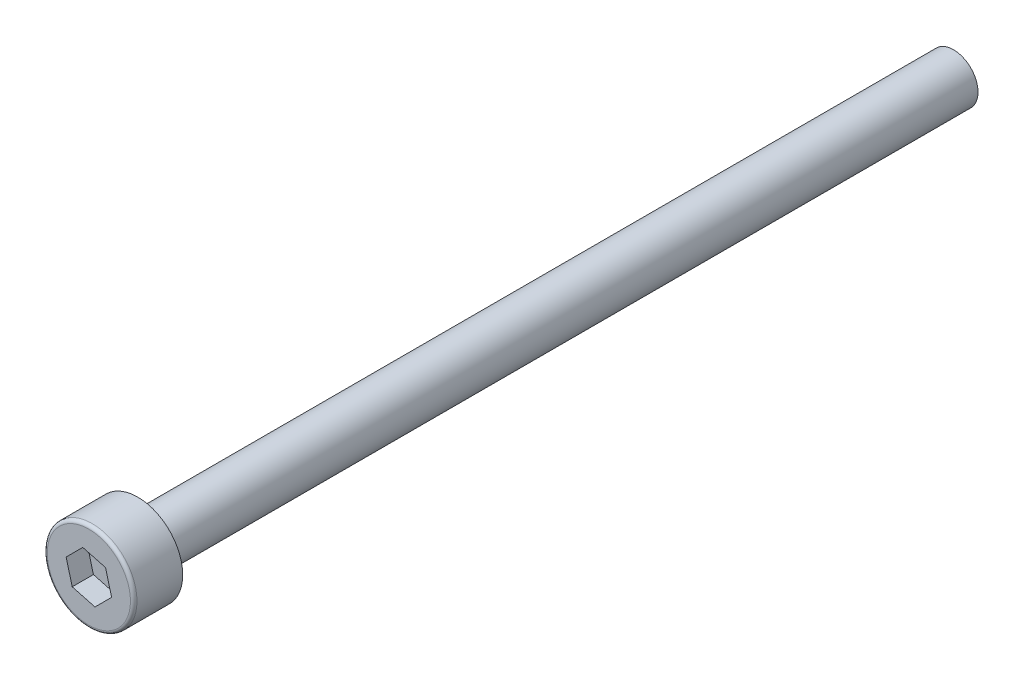
ISO-10303-21;
HEADER;
FILE_DESCRIPTION(('STEP AP214'),'2;1');
FILE_NAME('part.step','',(''),(''),'','','');
FILE_SCHEMA(('AUTOMOTIVE_DESIGN { 1 0 10303 214 1 1 1 1 }'));
ENDSEC;
DATA;
#1=APPLICATION_CONTEXT('core data for automotive mechanical design processes');
#2=APPLICATION_PROTOCOL_DEFINITION('international standard','automotive_design',2000,#1);
#3=PRODUCT_CONTEXT('',#1,'mechanical');
#4=PRODUCT('Part','Part','',(#3));
#5=PRODUCT_RELATED_PRODUCT_CATEGORY('part','',(#4));
#6=PRODUCT_DEFINITION_FORMATION('','',#4);
#7=PRODUCT_DEFINITION_CONTEXT('part definition',#1,'design');
#8=PRODUCT_DEFINITION('design','',#6,#7);
#9=PRODUCT_DEFINITION_SHAPE('','',#8);
#10=(LENGTH_UNIT() NAMED_UNIT(*) SI_UNIT(.MILLI.,.METRE.));
#11=(NAMED_UNIT(*) PLANE_ANGLE_UNIT() SI_UNIT($,.RADIAN.));
#12=(NAMED_UNIT(*) SI_UNIT($,.STERADIAN.) SOLID_ANGLE_UNIT());
#13=UNCERTAINTY_MEASURE_WITH_UNIT(LENGTH_MEASURE(1.E-05),#10,'distance_accuracy_value','');
#14=(GEOMETRIC_REPRESENTATION_CONTEXT(3) GLOBAL_UNCERTAINTY_ASSIGNED_CONTEXT((#13)) GLOBAL_UNIT_ASSIGNED_CONTEXT((#10,
#11,#12)) REPRESENTATION_CONTEXT('',''));
#15=CARTESIAN_POINT('',(0.,0.,0.));
#16=DIRECTION('',(0.,0.,1.));
#17=DIRECTION('',(1.,0.,0.));
#18=AXIS2_PLACEMENT_3D('',#15,#16,#17);
#19=CARTESIAN_POINT('',(0.,0.,0.));
#20=DIRECTION('',(0.,0.,1.));
#21=DIRECTION('',(1.,0.,0.));
#22=AXIS2_PLACEMENT_3D('',#19,#20,#21);
#23=PLANE('',#22);
#24=CARTESIAN_POINT('',(0.,0.,0.));
#25=DIRECTION('',(0.,0.,1.));
#26=DIRECTION('',(1.,0.,0.));
#27=AXIS2_PLACEMENT_3D('',#24,#25,#26);
#28=CIRCLE('',#27,2.75);
#29=CARTESIAN_POINT('',(2.75,0.,0.));
#30=VERTEX_POINT('',#29);
#31=EDGE_CURVE('E137',#30,#30,#28,.T.);
#32=ORIENTED_EDGE('',*,*,#31,.F.);
#33=EDGE_LOOP('',(#32));
#34=FACE_BOUND('',#33,.T.);
#35=CARTESIAN_POINT('',(0.,0.,0.));
#36=DIRECTION('',(0.,0.,1.));
#37=DIRECTION('',(1.,0.,0.));
#38=AXIS2_PLACEMENT_3D('',#35,#36,#37);
#39=CIRCLE('',#38,1.5);
#40=CARTESIAN_POINT('',(1.5,0.,0.));
#41=VERTEX_POINT('',#40);
#42=EDGE_CURVE('E145',#41,#41,#39,.F.);
#43=ORIENTED_EDGE('',*,*,#42,.F.);
#44=EDGE_LOOP('',(#43));
#45=FACE_BOUND('',#44,.T.);
#46=ADVANCED_FACE('F34',(#34,#45),#23,.F.);
#47=CARTESIAN_POINT('',(0.,0.,3.));
#48=DIRECTION('',(0.,0.,-1.));
#49=DIRECTION('',(-1.,0.,0.));
#50=AXIS2_PLACEMENT_3D('',#47,#48,#49);
#51=CYLINDRICAL_SURFACE('',#50,2.75);
#52=CARTESIAN_POINT('',(0.,0.,2.8));
#53=DIRECTION('',(0.,0.,1.));
#54=DIRECTION('',(1.,0.,0.));
#55=AXIS2_PLACEMENT_3D('',#52,#53,#54);
#56=CIRCLE('',#55,2.75);
#57=CARTESIAN_POINT('',(2.75,0.,2.8));
#58=VERTEX_POINT('',#57);
#59=EDGE_CURVE('E11',#58,#58,#56,.F.);
#60=ORIENTED_EDGE('',*,*,#59,.T.);
#61=EDGE_LOOP('',(#60));
#62=FACE_BOUND('',#61,.T.);
#63=ORIENTED_EDGE('',*,*,#31,.T.);
#64=EDGE_LOOP('',(#63));
#65=FACE_BOUND('',#64,.T.);
#66=ADVANCED_FACE('F164',(#62,#65),#51,.T.);
#67=CARTESIAN_POINT('',(0.,0.,3.));
#68=DIRECTION('',(0.,0.,1.));
#69=DIRECTION('',(1.,0.,0.));
#70=AXIS2_PLACEMENT_3D('',#67,#68,#69);
#71=PLANE('',#70);
#72=CARTESIAN_POINT('',(0.,0.,3.));
#73=DIRECTION('',(0.,0.,1.));
#74=DIRECTION('',(1.,0.,0.));
#75=AXIS2_PLACEMENT_3D('',#72,#73,#74);
#76=CIRCLE('',#75,2.55);
#77=CARTESIAN_POINT('',(2.55,0.,3.));
#78=VERTEX_POINT('',#77);
#79=EDGE_CURVE('E42',#78,#78,#76,.T.);
#80=ORIENTED_EDGE('',*,*,#79,.T.);
#81=EDGE_LOOP('',(#80));
#82=FACE_BOUND('',#81,.T.);
#83=DIRECTION('',(0.258819045102521,-0.965925826289068,0.));
#84=VECTOR('',#83,1.);
#85=CARTESIAN_POINT('',(-1.39419383956301,0.373573113403356,3.));
#86=LINE('',#85,#84);
#87=CARTESIAN_POINT('',(-1.39419383956301,0.373573113403356,3.));
#88=VERTEX_POINT('',#87);
#89=CARTESIAN_POINT('',(-1.02062072615966,-1.02062072615966,3.));
#90=VERTEX_POINT('',#89);
#91=EDGE_CURVE('E49',#88,#90,#86,.T.);
#92=ORIENTED_EDGE('',*,*,#91,.F.);
#93=DIRECTION('',(-0.707106781186548,-0.707106781186548,0.));
#94=VECTOR('',#93,1.);
#95=CARTESIAN_POINT('',(-0.373573113403355,1.39419383956301,3.));
#96=LINE('',#95,#94);
#97=CARTESIAN_POINT('',(-0.373573113403355,1.39419383956301,3.));
#98=VERTEX_POINT('',#97);
#99=EDGE_CURVE('E133',#98,#88,#96,.T.);
#100=ORIENTED_EDGE('',*,*,#99,.F.);
#101=DIRECTION('',(-0.965925826289068,0.258819045102521,0.));
#102=VECTOR('',#101,1.);
#103=CARTESIAN_POINT('',(1.02062072615966,1.02062072615966,3.));
#104=LINE('',#103,#102);
#105=CARTESIAN_POINT('',(1.02062072615966,1.02062072615966,3.));
#106=VERTEX_POINT('',#105);
#107=EDGE_CURVE('E131',#106,#98,#104,.T.);
#108=ORIENTED_EDGE('',*,*,#107,.F.);
#109=DIRECTION('',(-0.258819045102521,0.965925826289068,0.));
#110=VECTOR('',#109,1.);
#111=CARTESIAN_POINT('',(1.39419383956301,-0.373573113403355,3.));
#112=LINE('',#111,#110);
#113=CARTESIAN_POINT('',(1.39419383956301,-0.373573113403355,3.));
#114=VERTEX_POINT('',#113);
#115=EDGE_CURVE('E97',#114,#106,#112,.T.);
#116=ORIENTED_EDGE('',*,*,#115,.F.);
#117=DIRECTION('',(0.707106781186548,0.707106781186548,0.));
#118=VECTOR('',#117,1.);
#119=CARTESIAN_POINT('',(0.373573113403355,-1.39419383956301,3.));
#120=LINE('',#119,#118);
#121=CARTESIAN_POINT('',(0.373573113403355,-1.39419383956301,3.));
#122=VERTEX_POINT('',#121);
#123=EDGE_CURVE('E127',#122,#114,#120,.T.);
#124=ORIENTED_EDGE('',*,*,#123,.F.);
#125=DIRECTION('',(0.965925826289068,-0.258819045102521,0.));
#126=VECTOR('',#125,1.);
#127=CARTESIAN_POINT('',(-1.02062072615966,-1.02062072615966,3.));
#128=LINE('',#127,#126);
#129=EDGE_CURVE('E123',#90,#122,#128,.T.);
#130=ORIENTED_EDGE('',*,*,#129,.F.);
#131=EDGE_LOOP('',(#92,#100,#108,#116,#124,#130));
#132=FACE_BOUND('',#131,.T.);
#133=ADVANCED_FACE('F150',(#82,#132),#71,.T.);
#134=CARTESIAN_POINT('',(-1.39419383956301,0.373573113403356,1.7));
#135=DIRECTION('',(-0.965925826289068,-0.258819045102521,0.));
#136=DIRECTION('',(0.258819045102521,-0.965925826289068,0.));
#137=AXIS2_PLACEMENT_3D('',#134,#135,#136);
#138=PLANE('',#137);
#139=ORIENTED_EDGE('',*,*,#91,.T.);
#140=DIRECTION('',(0.,0.,1.));
#141=VECTOR('',#140,1.);
#142=CARTESIAN_POINT('',(-1.02062072615966,-1.02062072615966,1.7));
#143=LINE('',#142,#141);
#144=CARTESIAN_POINT('',(-1.02062072615966,-1.02062072615966,1.7));
#145=VERTEX_POINT('',#144);
#146=EDGE_CURVE('E79',#145,#90,#143,.T.);
#147=ORIENTED_EDGE('',*,*,#146,.F.);
#148=DIRECTION('',(0.258819045102521,-0.965925826289068,0.));
#149=VECTOR('',#148,1.);
#150=CARTESIAN_POINT('',(-1.39419383956301,0.373573113403356,1.7));
#151=LINE('',#150,#149);
#152=CARTESIAN_POINT('',(-1.39419383956301,0.373573113403356,1.7));
#153=VERTEX_POINT('',#152);
#154=EDGE_CURVE('E135',#153,#145,#151,.T.);
#155=ORIENTED_EDGE('',*,*,#154,.F.);
#156=DIRECTION('',(0.,0.,1.));
#157=VECTOR('',#156,1.);
#158=CARTESIAN_POINT('',(-1.39419383956301,0.373573113403356,1.7));
#159=LINE('',#158,#157);
#160=EDGE_CURVE('E57',#153,#88,#159,.T.);
#161=ORIENTED_EDGE('',*,*,#160,.T.);
#162=EDGE_LOOP('',(#139,#147,#155,#161));
#163=FACE_BOUND('',#162,.T.);
#164=ADVANCED_FACE('F176',(#163),#138,.F.);
#165=CARTESIAN_POINT('',(-0.373573113403355,1.39419383956301,1.7));
#166=DIRECTION('',(-0.707106781186548,0.707106781186548,0.));
#167=DIRECTION('',(-0.707106781186548,-0.707106781186548,0.));
#168=AXIS2_PLACEMENT_3D('',#165,#166,#167);
#169=PLANE('',#168);
#170=ORIENTED_EDGE('',*,*,#99,.T.);
#171=ORIENTED_EDGE('',*,*,#160,.F.);
#172=DIRECTION('',(-0.707106781186548,-0.707106781186548,0.));
#173=VECTOR('',#172,1.);
#174=CARTESIAN_POINT('',(-0.373573113403355,1.39419383956301,1.7));
#175=LINE('',#174,#173);
#176=CARTESIAN_POINT('',(-0.373573113403355,1.39419383956301,1.7));
#177=VERTEX_POINT('',#176);
#178=EDGE_CURVE('E109',#177,#153,#175,.T.);
#179=ORIENTED_EDGE('',*,*,#178,.F.);
#180=DIRECTION('',(0.,0.,1.));
#181=VECTOR('',#180,1.);
#182=CARTESIAN_POINT('',(-0.373573113403355,1.39419383956301,1.7));
#183=LINE('',#182,#181);
#184=EDGE_CURVE('E101',#177,#98,#183,.T.);
#185=ORIENTED_EDGE('',*,*,#184,.T.);
#186=EDGE_LOOP('',(#170,#171,#179,#185));
#187=FACE_BOUND('',#186,.T.);
#188=ADVANCED_FACE('F179',(#187),#169,.F.);
#189=CARTESIAN_POINT('',(1.02062072615966,1.02062072615966,1.7));
#190=DIRECTION('',(0.258819045102521,0.965925826289068,0.));
#191=DIRECTION('',(-0.965925826289068,0.258819045102521,0.));
#192=AXIS2_PLACEMENT_3D('',#189,#190,#191);
#193=PLANE('',#192);
#194=ORIENTED_EDGE('',*,*,#107,.T.);
#195=ORIENTED_EDGE('',*,*,#184,.F.);
#196=DIRECTION('',(-0.965925826289068,0.258819045102521,0.));
#197=VECTOR('',#196,1.);
#198=CARTESIAN_POINT('',(1.02062072615966,1.02062072615966,1.7));
#199=LINE('',#198,#197);
#200=CARTESIAN_POINT('',(1.02062072615966,1.02062072615966,1.7));
#201=VERTEX_POINT('',#200);
#202=EDGE_CURVE('E105',#201,#177,#199,.T.);
#203=ORIENTED_EDGE('',*,*,#202,.F.);
#204=DIRECTION('',(0.,0.,1.));
#205=VECTOR('',#204,1.);
#206=CARTESIAN_POINT('',(1.02062072615966,1.02062072615966,1.7));
#207=LINE('',#206,#205);
#208=EDGE_CURVE('E90',#201,#106,#207,.T.);
#209=ORIENTED_EDGE('',*,*,#208,.T.);
#210=EDGE_LOOP('',(#194,#195,#203,#209));
#211=FACE_BOUND('',#210,.T.);
#212=ADVANCED_FACE('F106',(#211),#193,.F.);
#213=CARTESIAN_POINT('',(1.39419383956301,-0.373573113403355,1.7));
#214=DIRECTION('',(0.965925826289068,0.258819045102521,0.));
#215=DIRECTION('',(-0.258819045102521,0.965925826289068,0.));
#216=AXIS2_PLACEMENT_3D('',#213,#214,#215);
#217=PLANE('',#216);
#218=ORIENTED_EDGE('',*,*,#115,.T.);
#219=ORIENTED_EDGE('',*,*,#208,.F.);
#220=DIRECTION('',(-0.258819045102521,0.965925826289068,0.));
#221=VECTOR('',#220,1.);
#222=CARTESIAN_POINT('',(1.39419383956301,-0.373573113403355,1.7));
#223=LINE('',#222,#221);
#224=CARTESIAN_POINT('',(1.39419383956301,-0.373573113403355,1.7));
#225=VERTEX_POINT('',#224);
#226=EDGE_CURVE('E94',#225,#201,#223,.T.);
#227=ORIENTED_EDGE('',*,*,#226,.F.);
#228=DIRECTION('',(0.,0.,1.));
#229=VECTOR('',#228,1.);
#230=CARTESIAN_POINT('',(1.39419383956301,-0.373573113403355,1.7));
#231=LINE('',#230,#229);
#232=EDGE_CURVE('E102',#225,#114,#231,.T.);
#233=ORIENTED_EDGE('',*,*,#232,.T.);
#234=EDGE_LOOP('',(#218,#219,#227,#233));
#235=FACE_BOUND('',#234,.T.);
#236=ADVANCED_FACE('F92',(#235),#217,.F.);
#237=CARTESIAN_POINT('',(0.373573113403355,-1.39419383956301,1.7));
#238=DIRECTION('',(0.707106781186548,-0.707106781186548,0.));
#239=DIRECTION('',(0.707106781186548,0.707106781186548,0.));
#240=AXIS2_PLACEMENT_3D('',#237,#238,#239);
#241=PLANE('',#240);
#242=ORIENTED_EDGE('',*,*,#123,.T.);
#243=ORIENTED_EDGE('',*,*,#232,.F.);
#244=DIRECTION('',(0.707106781186548,0.707106781186548,0.));
#245=VECTOR('',#244,1.);
#246=CARTESIAN_POINT('',(0.373573113403355,-1.39419383956301,1.7));
#247=LINE('',#246,#245);
#248=CARTESIAN_POINT('',(0.373573113403355,-1.39419383956301,1.7));
#249=VERTEX_POINT('',#248);
#250=EDGE_CURVE('E115',#249,#225,#247,.T.);
#251=ORIENTED_EDGE('',*,*,#250,.F.);
#252=DIRECTION('',(0.,0.,1.));
#253=VECTOR('',#252,1.);
#254=CARTESIAN_POINT('',(0.373573113403355,-1.39419383956301,1.7));
#255=LINE('',#254,#253);
#256=EDGE_CURVE('E140',#249,#122,#255,.T.);
#257=ORIENTED_EDGE('',*,*,#256,.T.);
#258=EDGE_LOOP('',(#242,#243,#251,#257));
#259=FACE_BOUND('',#258,.T.);
#260=ADVANCED_FACE('F183',(#259),#241,.F.);
#261=CARTESIAN_POINT('',(-1.02062072615966,-1.02062072615966,1.7));
#262=DIRECTION('',(-0.258819045102521,-0.965925826289068,0.));
#263=DIRECTION('',(0.965925826289068,-0.258819045102521,0.));
#264=AXIS2_PLACEMENT_3D('',#261,#262,#263);
#265=PLANE('',#264);
#266=ORIENTED_EDGE('',*,*,#129,.T.);
#267=ORIENTED_EDGE('',*,*,#256,.F.);
#268=DIRECTION('',(0.965925826289068,-0.258819045102521,0.));
#269=VECTOR('',#268,1.);
#270=CARTESIAN_POINT('',(-1.02062072615966,-1.02062072615966,1.7));
#271=LINE('',#270,#269);
#272=EDGE_CURVE('E117',#145,#249,#271,.T.);
#273=ORIENTED_EDGE('',*,*,#272,.F.);
#274=ORIENTED_EDGE('',*,*,#146,.T.);
#275=EDGE_LOOP('',(#266,#267,#273,#274));
#276=FACE_BOUND('',#275,.T.);
#277=ADVANCED_FACE('F180',(#276),#265,.F.);
#278=CARTESIAN_POINT('',(0.,0.,1.7));
#279=DIRECTION('',(0.,0.,1.));
#280=DIRECTION('',(1.,0.,0.));
#281=AXIS2_PLACEMENT_3D('',#278,#279,#280);
#282=PLANE('',#281);
#283=ORIENTED_EDGE('',*,*,#154,.T.);
#284=ORIENTED_EDGE('',*,*,#272,.T.);
#285=ORIENTED_EDGE('',*,*,#250,.T.);
#286=ORIENTED_EDGE('',*,*,#226,.T.);
#287=ORIENTED_EDGE('',*,*,#202,.T.);
#288=ORIENTED_EDGE('',*,*,#178,.T.);
#289=EDGE_LOOP('',(#283,#284,#285,#286,#287,#288));
#290=FACE_BOUND('',#289,.T.);
#291=ADVANCED_FACE('F112',(#290),#282,.T.);
#292=CARTESIAN_POINT('',(0.,0.,-50.));
#293=DIRECTION('',(0.,0.,1.));
#294=DIRECTION('',(1.,0.,0.));
#295=AXIS2_PLACEMENT_3D('',#292,#293,#294);
#296=CYLINDRICAL_SURFACE('',#295,1.5);
#297=CARTESIAN_POINT('',(0.,0.,-50.));
#298=DIRECTION('',(0.,0.,-1.));
#299=DIRECTION('',(-1.,0.,0.));
#300=AXIS2_PLACEMENT_3D('',#297,#298,#299);
#301=CIRCLE('',#300,1.5);
#302=CARTESIAN_POINT('',(-1.5,0.,-50.));
#303=VERTEX_POINT('',#302);
#304=EDGE_CURVE('E124',#303,#303,#301,.T.);
#305=ORIENTED_EDGE('',*,*,#304,.F.);
#306=EDGE_LOOP('',(#305));
#307=FACE_BOUND('',#306,.T.);
#308=ORIENTED_EDGE('',*,*,#42,.T.);
#309=EDGE_LOOP('',(#308));
#310=FACE_BOUND('',#309,.T.);
#311=ADVANCED_FACE('F159',(#307,#310),#296,.T.);
#312=CARTESIAN_POINT('',(0.,0.,-50.));
#313=DIRECTION('',(0.,0.,-1.));
#314=DIRECTION('',(-1.,0.,0.));
#315=AXIS2_PLACEMENT_3D('',#312,#313,#314);
#316=PLANE('',#315);
#317=ORIENTED_EDGE('',*,*,#304,.T.);
#318=EDGE_LOOP('',(#317));
#319=FACE_BOUND('',#318,.T.);
#320=ADVANCED_FACE('F154',(#319),#316,.T.);
#321=CARTESIAN_POINT('',(0.,0.,2.8));
#322=DIRECTION('',(0.,0.,1.));
#323=DIRECTION('',(1.,0.,0.));
#324=AXIS2_PLACEMENT_3D('',#321,#322,#323);
#325=TOROIDAL_SURFACE('',#324,2.55,0.2);
#326=ORIENTED_EDGE('',*,*,#59,.F.);
#327=EDGE_LOOP('',(#326));
#328=FACE_BOUND('',#327,.T.);
#329=ORIENTED_EDGE('',*,*,#79,.F.);
#330=EDGE_LOOP('',(#329));
#331=FACE_BOUND('',#330,.T.);
#332=ADVANCED_FACE('F36',(#328,#331),#325,.T.);
#333=CLOSED_SHELL('',(#46,#66,#133,#164,#188,#212,#236,#260,#277,#291,#311,#320,#332));
#334=MANIFOLD_SOLID_BREP('B2',#333);
#335=ADVANCED_BREP_SHAPE_REPRESENTATION('',(#18,#334),#14);
#336=SHAPE_DEFINITION_REPRESENTATION(#9,#335);
ENDSEC;
END-ISO-10303-21;
